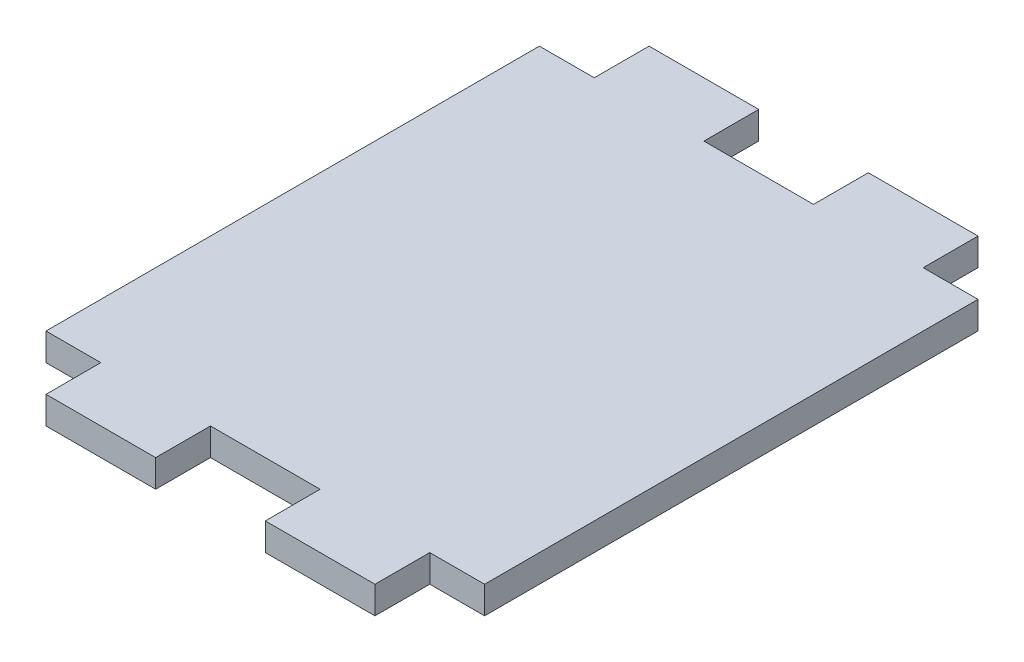
ISO-10303-21;
HEADER;
FILE_DESCRIPTION(('STEP AP214'),'2;1');
FILE_NAME('part.step','',(''),(''),'','','');
FILE_SCHEMA(('AUTOMOTIVE_DESIGN { 1 0 10303 214 1 1 1 1 }'));
ENDSEC;
DATA;
#1=APPLICATION_CONTEXT('core data for automotive mechanical design processes');
#2=APPLICATION_PROTOCOL_DEFINITION('international standard','automotive_design',2000,#1);
#3=PRODUCT_CONTEXT('',#1,'mechanical');
#4=PRODUCT('Part','Part','',(#3));
#5=PRODUCT_RELATED_PRODUCT_CATEGORY('part','',(#4));
#6=PRODUCT_DEFINITION_FORMATION('','',#4);
#7=PRODUCT_DEFINITION_CONTEXT('part definition',#1,'design');
#8=PRODUCT_DEFINITION('design','',#6,#7);
#9=PRODUCT_DEFINITION_SHAPE('','',#8);
#10=(LENGTH_UNIT() NAMED_UNIT(*) SI_UNIT(.MILLI.,.METRE.));
#11=(NAMED_UNIT(*) PLANE_ANGLE_UNIT() SI_UNIT($,.RADIAN.));
#12=(NAMED_UNIT(*) SI_UNIT($,.STERADIAN.) SOLID_ANGLE_UNIT());
#13=UNCERTAINTY_MEASURE_WITH_UNIT(LENGTH_MEASURE(1.E-05),#10,'distance_accuracy_value','');
#14=(GEOMETRIC_REPRESENTATION_CONTEXT(3) GLOBAL_UNCERTAINTY_ASSIGNED_CONTEXT((#13)) GLOBAL_UNIT_ASSIGNED_CONTEXT((#10,
#11,#12)) REPRESENTATION_CONTEXT('',''));
#15=CARTESIAN_POINT('',(0.,0.,0.));
#16=DIRECTION('',(0.,0.,1.));
#17=DIRECTION('',(1.,0.,0.));
#18=AXIS2_PLACEMENT_3D('',#15,#16,#17);
#19=CARTESIAN_POINT('',(0.,0.,0.));
#20=DIRECTION('',(0.,0.,1.));
#21=DIRECTION('',(1.,0.,0.));
#22=AXIS2_PLACEMENT_3D('',#19,#20,#21);
#23=PLANE('',#22);
#24=DIRECTION('',(0.,1.,0.));
#25=VECTOR('',#24,1.);
#26=CARTESIAN_POINT('',(285.040948436872,355.55542840225,0.));
#27=LINE('',#26,#25);
#28=CARTESIAN_POINT('',(285.040948436872,355.55542840225,0.));
#29=VERTEX_POINT('',#28);
#30=CARTESIAN_POINT('',(285.040948436872,358.73042840225,0.));
#31=VERTEX_POINT('',#30);
#32=EDGE_CURVE('E342',#29,#31,#27,.T.);
#33=ORIENTED_EDGE('',*,*,#32,.T.);
#34=DIRECTION('',(-1.,0.,0.));
#35=VECTOR('',#34,1.);
#36=CARTESIAN_POINT('',(316.790948436872,358.73042840225,0.));
#37=LINE('',#36,#35);
#38=CARTESIAN_POINT('',(272.340948436872,358.73042840225,0.));
#39=VERTEX_POINT('',#38);
#40=EDGE_CURVE('E230',#31,#39,#37,.T.);
#41=ORIENTED_EDGE('',*,*,#40,.T.);
#42=DIRECTION('',(0.,1.,0.));
#43=VECTOR('',#42,1.);
#44=CARTESIAN_POINT('',(272.340948436872,355.55542840225,0.));
#45=LINE('',#44,#43);
#46=CARTESIAN_POINT('',(272.340948436872,355.55542840225,0.));
#47=VERTEX_POINT('',#46);
#48=EDGE_CURVE('E274',#47,#39,#45,.T.);
#49=ORIENTED_EDGE('',*,*,#48,.F.);
#50=DIRECTION('',(1.,0.,0.));
#51=VECTOR('',#50,1.);
#52=CARTESIAN_POINT('',(265.990948436872,355.55542840225,0.));
#53=LINE('',#52,#51);
#54=EDGE_CURVE('E245',#47,#29,#53,.T.);
#55=ORIENTED_EDGE('',*,*,#54,.T.);
#56=EDGE_LOOP('',(#33,#41,#49,#55));
#57=FACE_BOUND('',#56,.T.);
#58=ADVANCED_FACE('F33',(#57),#23,.T.);
#59=CARTESIAN_POINT('',(0.,0.,-69.85));
#60=DIRECTION('',(0.,0.,1.));
#61=DIRECTION('',(1.,0.,0.));
#62=AXIS2_PLACEMENT_3D('',#59,#60,#61);
#63=PLANE('',#62);
#64=DIRECTION('',(-1.,0.,0.));
#65=VECTOR('',#64,1.);
#66=CARTESIAN_POINT('',(316.790948436872,358.73042840225,-69.85));
#67=LINE('',#66,#65);
#68=CARTESIAN_POINT('',(285.040948436872,358.73042840225,-69.85));
#69=VERTEX_POINT('',#68);
#70=CARTESIAN_POINT('',(272.340948436872,358.73042840225,-69.85));
#71=VERTEX_POINT('',#70);
#72=EDGE_CURVE('E238',#69,#71,#67,.T.);
#73=ORIENTED_EDGE('',*,*,#72,.F.);
#74=DIRECTION('',(0.,1.,0.));
#75=VECTOR('',#74,1.);
#76=CARTESIAN_POINT('',(285.040948436872,355.55542840225,-69.85));
#77=LINE('',#76,#75);
#78=CARTESIAN_POINT('',(285.040948436872,355.55542840225,-69.85));
#79=VERTEX_POINT('',#78);
#80=EDGE_CURVE('E209',#79,#69,#77,.T.);
#81=ORIENTED_EDGE('',*,*,#80,.F.);
#82=DIRECTION('',(1.,0.,0.));
#83=VECTOR('',#82,1.);
#84=CARTESIAN_POINT('',(265.990948436872,355.55542840225,-69.85));
#85=LINE('',#84,#83);
#86=CARTESIAN_POINT('',(272.340948436872,355.55542840225,-69.85));
#87=VERTEX_POINT('',#86);
#88=EDGE_CURVE('E239',#87,#79,#85,.T.);
#89=ORIENTED_EDGE('',*,*,#88,.F.);
#90=DIRECTION('',(0.,1.,0.));
#91=VECTOR('',#90,1.);
#92=CARTESIAN_POINT('',(272.340948436872,355.55542840225,-69.85));
#93=LINE('',#92,#91);
#94=EDGE_CURVE('E227',#87,#71,#93,.T.);
#95=ORIENTED_EDGE('',*,*,#94,.T.);
#96=EDGE_LOOP('',(#73,#81,#89,#95));
#97=FACE_BOUND('',#96,.T.);
#98=ADVANCED_FACE('F393',(#97),#63,.F.);
#99=CARTESIAN_POINT('',(316.790948436872,355.55542840225,-69.85));
#100=DIRECTION('',(1.,0.,0.));
#101=DIRECTION('',(0.,1.,0.));
#102=AXIS2_PLACEMENT_3D('',#99,#100,#101);
#103=PLANE('',#102);
#104=DIRECTION('',(0.,1.,0.));
#105=VECTOR('',#104,1.);
#106=CARTESIAN_POINT('',(316.790948436872,355.55542840225,-6.35000000000002));
#107=LINE('',#106,#105);
#108=CARTESIAN_POINT('',(316.790948436872,355.55542840225,-6.35000000000002));
#109=VERTEX_POINT('',#108);
#110=CARTESIAN_POINT('',(316.790948436872,358.73042840225,-6.35000000000002));
#111=VERTEX_POINT('',#110);
#112=EDGE_CURVE('E176',#109,#111,#107,.T.);
#113=ORIENTED_EDGE('',*,*,#112,.F.);
#114=DIRECTION('',(0.,0.,1.));
#115=VECTOR('',#114,1.);
#116=CARTESIAN_POINT('',(316.790948436872,355.55542840225,-69.85));
#117=LINE('',#116,#115);
#118=CARTESIAN_POINT('',(316.790948436872,355.55542840225,-63.5));
#119=VERTEX_POINT('',#118);
#120=EDGE_CURVE('E11',#119,#109,#117,.T.);
#121=ORIENTED_EDGE('',*,*,#120,.F.);
#122=DIRECTION('',(0.,1.,0.));
#123=VECTOR('',#122,1.);
#124=CARTESIAN_POINT('',(316.790948436872,355.55542840225,-63.5));
#125=LINE('',#124,#123);
#126=CARTESIAN_POINT('',(316.790948436872,358.73042840225,-63.5));
#127=VERTEX_POINT('',#126);
#128=EDGE_CURVE('E211',#119,#127,#125,.T.);
#129=ORIENTED_EDGE('',*,*,#128,.T.);
#130=DIRECTION('',(0.,0.,1.));
#131=VECTOR('',#130,1.);
#132=CARTESIAN_POINT('',(316.790948436872,358.73042840225,-69.85));
#133=LINE('',#132,#131);
#134=EDGE_CURVE('E37',#127,#111,#133,.T.);
#135=ORIENTED_EDGE('',*,*,#134,.T.);
#136=EDGE_LOOP('',(#113,#121,#129,#135));
#137=FACE_BOUND('',#136,.T.);
#138=ADVANCED_FACE('F35',(#137),#103,.T.);
#139=CARTESIAN_POINT('',(265.990948436872,355.55542840225,-69.85));
#140=DIRECTION('',(0.,-1.,0.));
#141=DIRECTION('',(0.,0.,-1.));
#142=AXIS2_PLACEMENT_3D('',#139,#140,#141);
#143=PLANE('',#142);
#144=DIRECTION('',(0.,0.,1.));
#145=VECTOR('',#144,1.);
#146=CARTESIAN_POINT('',(310.440948436872,355.55542840225,0.));
#147=LINE('',#146,#145);
#148=CARTESIAN_POINT('',(310.440948436872,355.55542840225,-6.35000000000002));
#149=VERTEX_POINT('',#148);
#150=CARTESIAN_POINT('',(310.440948436872,355.55542840225,0.));
#151=VERTEX_POINT('',#150);
#152=EDGE_CURVE('E182',#149,#151,#147,.T.);
#153=ORIENTED_EDGE('',*,*,#152,.T.);
#154=CARTESIAN_POINT('',(297.740948436872,355.55542840225,0.));
#155=VERTEX_POINT('',#154);
#156=EDGE_CURVE('E244',#155,#151,#53,.T.);
#157=ORIENTED_EDGE('',*,*,#156,.F.);
#158=DIRECTION('',(0.,0.,-1.));
#159=VECTOR('',#158,1.);
#160=CARTESIAN_POINT('',(297.740948436872,355.55542840225,0.));
#161=LINE('',#160,#159);
#162=CARTESIAN_POINT('',(297.740948436872,355.55542840225,-6.35000000000002));
#163=VERTEX_POINT('',#162);
#164=EDGE_CURVE('E58',#155,#163,#161,.T.);
#165=ORIENTED_EDGE('',*,*,#164,.T.);
#166=DIRECTION('',(-1.,0.,0.));
#167=VECTOR('',#166,1.);
#168=CARTESIAN_POINT('',(285.040948436872,355.55542840225,-6.35000000000002));
#169=LINE('',#168,#167);
#170=CARTESIAN_POINT('',(285.040948436872,355.55542840225,-6.35000000000002));
#171=VERTEX_POINT('',#170);
#172=EDGE_CURVE('E339',#163,#171,#169,.T.);
#173=ORIENTED_EDGE('',*,*,#172,.T.);
#174=DIRECTION('',(0.,0.,1.));
#175=VECTOR('',#174,1.);
#176=CARTESIAN_POINT('',(285.040948436872,355.55542840225,0.));
#177=LINE('',#176,#175);
#178=EDGE_CURVE('E334',#171,#29,#177,.T.);
#179=ORIENTED_EDGE('',*,*,#178,.T.);
#180=ORIENTED_EDGE('',*,*,#54,.F.);
#181=DIRECTION('',(0.,0.,-1.));
#182=VECTOR('',#181,1.);
#183=CARTESIAN_POINT('',(272.340948436872,355.55542840225,0.));
#184=LINE('',#183,#182);
#185=CARTESIAN_POINT('',(272.340948436872,355.55542840225,-6.35000000000002));
#186=VERTEX_POINT('',#185);
#187=EDGE_CURVE('E358',#47,#186,#184,.T.);
#188=ORIENTED_EDGE('',*,*,#187,.T.);
#189=DIRECTION('',(-1.,0.,0.));
#190=VECTOR('',#189,1.);
#191=CARTESIAN_POINT('',(265.990948436872,355.55542840225,-6.35000000000002));
#192=LINE('',#191,#190);
#193=CARTESIAN_POINT('',(265.990948436872,355.55542840225,-6.35000000000002));
#194=VERTEX_POINT('',#193);
#195=EDGE_CURVE('E281',#186,#194,#192,.T.);
#196=ORIENTED_EDGE('',*,*,#195,.T.);
#197=DIRECTION('',(0.,0.,1.));
#198=VECTOR('',#197,1.);
#199=CARTESIAN_POINT('',(265.990948436872,355.55542840225,-69.85));
#200=LINE('',#199,#198);
#201=CARTESIAN_POINT('',(265.990948436872,355.55542840225,-63.5));
#202=VERTEX_POINT('',#201);
#203=EDGE_CURVE('E42',#202,#194,#200,.T.);
#204=ORIENTED_EDGE('',*,*,#203,.F.);
#205=DIRECTION('',(1.,0.,0.));
#206=VECTOR('',#205,1.);
#207=CARTESIAN_POINT('',(265.990948436872,355.55542840225,-63.5));
#208=LINE('',#207,#206);
#209=CARTESIAN_POINT('',(272.340948436872,355.55542840225,-63.5));
#210=VERTEX_POINT('',#209);
#211=EDGE_CURVE('E215',#202,#210,#208,.T.);
#212=ORIENTED_EDGE('',*,*,#211,.T.);
#213=DIRECTION('',(0.,0.,-1.));
#214=VECTOR('',#213,1.);
#215=CARTESIAN_POINT('',(272.340948436872,355.55542840225,-69.85));
#216=LINE('',#215,#214);
#217=EDGE_CURVE('E218',#210,#87,#216,.T.);
#218=ORIENTED_EDGE('',*,*,#217,.T.);
#219=ORIENTED_EDGE('',*,*,#88,.T.);
#220=DIRECTION('',(0.,0.,1.));
#221=VECTOR('',#220,1.);
#222=CARTESIAN_POINT('',(285.040948436872,355.55542840225,-69.85));
#223=LINE('',#222,#221);
#224=CARTESIAN_POINT('',(285.040948436872,355.55542840225,-63.5));
#225=VERTEX_POINT('',#224);
#226=EDGE_CURVE('E282',#79,#225,#223,.T.);
#227=ORIENTED_EDGE('',*,*,#226,.T.);
#228=DIRECTION('',(1.,0.,0.));
#229=VECTOR('',#228,1.);
#230=CARTESIAN_POINT('',(285.040948436872,355.55542840225,-63.5));
#231=LINE('',#230,#229);
#232=CARTESIAN_POINT('',(297.740948436872,355.55542840225,-63.5));
#233=VERTEX_POINT('',#232);
#234=EDGE_CURVE('E285',#225,#233,#231,.T.);
#235=ORIENTED_EDGE('',*,*,#234,.T.);
#236=DIRECTION('',(0.,0.,-1.));
#237=VECTOR('',#236,1.);
#238=CARTESIAN_POINT('',(297.740948436872,355.55542840225,-69.85));
#239=LINE('',#238,#237);
#240=CARTESIAN_POINT('',(297.740948436872,355.55542840225,-69.85));
#241=VERTEX_POINT('',#240);
#242=EDGE_CURVE('E289',#233,#241,#239,.T.);
#243=ORIENTED_EDGE('',*,*,#242,.T.);
#244=CARTESIAN_POINT('',(310.440948436872,355.55542840225,-69.85));
#245=VERTEX_POINT('',#244);
#246=EDGE_CURVE('E237',#241,#245,#85,.T.);
#247=ORIENTED_EDGE('',*,*,#246,.T.);
#248=DIRECTION('',(0.,0.,1.));
#249=VECTOR('',#248,1.);
#250=CARTESIAN_POINT('',(310.440948436872,355.55542840225,-69.85));
#251=LINE('',#250,#249);
#252=CARTESIAN_POINT('',(310.440948436872,355.55542840225,-63.5));
#253=VERTEX_POINT('',#252);
#254=EDGE_CURVE('E196',#245,#253,#251,.T.);
#255=ORIENTED_EDGE('',*,*,#254,.T.);
#256=DIRECTION('',(1.,0.,0.));
#257=VECTOR('',#256,1.);
#258=CARTESIAN_POINT('',(316.790948436872,355.55542840225,-63.5));
#259=LINE('',#258,#257);
#260=EDGE_CURVE('E194',#253,#119,#259,.T.);
#261=ORIENTED_EDGE('',*,*,#260,.T.);
#262=ORIENTED_EDGE('',*,*,#120,.T.);
#263=DIRECTION('',(-1.,0.,0.));
#264=VECTOR('',#263,1.);
#265=CARTESIAN_POINT('',(316.790948436872,355.55542840225,-6.35000000000002));
#266=LINE('',#265,#264);
#267=EDGE_CURVE('E172',#109,#149,#266,.T.);
#268=ORIENTED_EDGE('',*,*,#267,.T.);
#269=EDGE_LOOP('',(#153,#157,#165,#173,#179,#180,#188,#196,#204,#212,#218,#219,#227,#235,#243,
#247,#255,#261,#262,#268));
#270=FACE_BOUND('',#269,.T.);
#271=ADVANCED_FACE('F191',(#270),#143,.T.);
#272=CARTESIAN_POINT('',(265.990948436872,358.73042840225,-69.85));
#273=DIRECTION('',(-1.,0.,0.));
#274=DIRECTION('',(0.,0.,1.));
#275=AXIS2_PLACEMENT_3D('',#272,#273,#274);
#276=PLANE('',#275);
#277=DIRECTION('',(0.,1.,0.));
#278=VECTOR('',#277,1.);
#279=CARTESIAN_POINT('',(265.990948436872,355.55542840225,-6.35000000000002));
#280=LINE('',#279,#278);
#281=CARTESIAN_POINT('',(265.990948436872,358.73042840225,-6.35000000000002));
#282=VERTEX_POINT('',#281);
#283=EDGE_CURVE('E264',#194,#282,#280,.T.);
#284=ORIENTED_EDGE('',*,*,#283,.T.);
#285=DIRECTION('',(0.,0.,1.));
#286=VECTOR('',#285,1.);
#287=CARTESIAN_POINT('',(265.990948436872,358.73042840225,-69.85));
#288=LINE('',#287,#286);
#289=CARTESIAN_POINT('',(265.990948436872,358.73042840225,-63.5));
#290=VERTEX_POINT('',#289);
#291=EDGE_CURVE('E249',#290,#282,#288,.T.);
#292=ORIENTED_EDGE('',*,*,#291,.F.);
#293=DIRECTION('',(0.,1.,0.));
#294=VECTOR('',#293,1.);
#295=CARTESIAN_POINT('',(265.990948436872,355.55542840225,-63.5));
#296=LINE('',#295,#294);
#297=EDGE_CURVE('E222',#202,#290,#296,.T.);
#298=ORIENTED_EDGE('',*,*,#297,.F.);
#299=ORIENTED_EDGE('',*,*,#203,.T.);
#300=EDGE_LOOP('',(#284,#292,#298,#299));
#301=FACE_BOUND('',#300,.T.);
#302=ADVANCED_FACE('F262',(#301),#276,.T.);
#303=CARTESIAN_POINT('',(316.790948436872,358.73042840225,-69.85));
#304=DIRECTION('',(0.,1.,0.));
#305=DIRECTION('',(0.,0.,1.));
#306=AXIS2_PLACEMENT_3D('',#303,#304,#305);
#307=PLANE('',#306);
#308=DIRECTION('',(0.,0.,1.));
#309=VECTOR('',#308,1.);
#310=CARTESIAN_POINT('',(310.440948436872,358.73042840225,0.));
#311=LINE('',#310,#309);
#312=CARTESIAN_POINT('',(310.440948436872,358.73042840225,-6.35000000000002));
#313=VERTEX_POINT('',#312);
#314=CARTESIAN_POINT('',(310.440948436872,358.73042840225,0.));
#315=VERTEX_POINT('',#314);
#316=EDGE_CURVE('E50',#313,#315,#311,.T.);
#317=ORIENTED_EDGE('',*,*,#316,.F.);
#318=DIRECTION('',(-1.,0.,0.));
#319=VECTOR('',#318,1.);
#320=CARTESIAN_POINT('',(316.790948436872,358.73042840225,-6.35000000000002));
#321=LINE('',#320,#319);
#322=EDGE_CURVE('E324',#111,#313,#321,.T.);
#323=ORIENTED_EDGE('',*,*,#322,.F.);
#324=ORIENTED_EDGE('',*,*,#134,.F.);
#325=DIRECTION('',(1.,0.,0.));
#326=VECTOR('',#325,1.);
#327=CARTESIAN_POINT('',(316.790948436872,358.73042840225,-63.5));
#328=LINE('',#327,#326);
#329=CARTESIAN_POINT('',(310.440948436872,358.73042840225,-63.5));
#330=VERTEX_POINT('',#329);
#331=EDGE_CURVE('E202',#330,#127,#328,.T.);
#332=ORIENTED_EDGE('',*,*,#331,.F.);
#333=DIRECTION('',(0.,0.,1.));
#334=VECTOR('',#333,1.);
#335=CARTESIAN_POINT('',(310.440948436872,358.73042840225,-69.85));
#336=LINE('',#335,#334);
#337=CARTESIAN_POINT('',(310.440948436872,358.73042840225,-69.85));
#338=VERTEX_POINT('',#337);
#339=EDGE_CURVE('E206',#338,#330,#336,.T.);
#340=ORIENTED_EDGE('',*,*,#339,.F.);
#341=CARTESIAN_POINT('',(297.740948436872,358.73042840225,-69.85));
#342=VERTEX_POINT('',#341);
#343=EDGE_CURVE('E234',#338,#342,#67,.T.);
#344=ORIENTED_EDGE('',*,*,#343,.T.);
#345=DIRECTION('',(0.,0.,-1.));
#346=VECTOR('',#345,1.);
#347=CARTESIAN_POINT('',(297.740948436872,358.73042840225,-69.85));
#348=LINE('',#347,#346);
#349=CARTESIAN_POINT('',(297.740948436872,358.73042840225,-63.5));
#350=VERTEX_POINT('',#349);
#351=EDGE_CURVE('E286',#350,#342,#348,.T.);
#352=ORIENTED_EDGE('',*,*,#351,.F.);
#353=DIRECTION('',(1.,0.,0.));
#354=VECTOR('',#353,1.);
#355=CARTESIAN_POINT('',(285.040948436872,358.73042840225,-63.5));
#356=LINE('',#355,#354);
#357=CARTESIAN_POINT('',(285.040948436872,358.73042840225,-63.5));
#358=VERTEX_POINT('',#357);
#359=EDGE_CURVE('E272',#358,#350,#356,.T.);
#360=ORIENTED_EDGE('',*,*,#359,.F.);
#361=DIRECTION('',(0.,0.,1.));
#362=VECTOR('',#361,1.);
#363=CARTESIAN_POINT('',(285.040948436872,358.73042840225,-69.85));
#364=LINE('',#363,#362);
#365=EDGE_CURVE('E268',#69,#358,#364,.T.);
#366=ORIENTED_EDGE('',*,*,#365,.F.);
#367=ORIENTED_EDGE('',*,*,#72,.T.);
#368=DIRECTION('',(0.,0.,-1.));
#369=VECTOR('',#368,1.);
#370=CARTESIAN_POINT('',(272.340948436872,358.73042840225,-69.85));
#371=LINE('',#370,#369);
#372=CARTESIAN_POINT('',(272.340948436872,358.73042840225,-63.5));
#373=VERTEX_POINT('',#372);
#374=EDGE_CURVE('E219',#373,#71,#371,.T.);
#375=ORIENTED_EDGE('',*,*,#374,.F.);
#376=DIRECTION('',(1.,0.,0.));
#377=VECTOR('',#376,1.);
#378=CARTESIAN_POINT('',(265.990948436872,358.73042840225,-63.5));
#379=LINE('',#378,#377);
#380=EDGE_CURVE('E213',#290,#373,#379,.T.);
#381=ORIENTED_EDGE('',*,*,#380,.F.);
#382=ORIENTED_EDGE('',*,*,#291,.T.);
#383=DIRECTION('',(-1.,0.,0.));
#384=VECTOR('',#383,1.);
#385=CARTESIAN_POINT('',(265.990948436872,358.73042840225,-6.35000000000002));
#386=LINE('',#385,#384);
#387=CARTESIAN_POINT('',(272.340948436872,358.73042840225,-6.35000000000002));
#388=VERTEX_POINT('',#387);
#389=EDGE_CURVE('E257',#388,#282,#386,.T.);
#390=ORIENTED_EDGE('',*,*,#389,.F.);
#391=DIRECTION('',(0.,0.,-1.));
#392=VECTOR('',#391,1.);
#393=CARTESIAN_POINT('',(272.340948436872,358.73042840225,0.));
#394=LINE('',#393,#392);
#395=EDGE_CURVE('E351',#39,#388,#394,.T.);
#396=ORIENTED_EDGE('',*,*,#395,.F.);
#397=ORIENTED_EDGE('',*,*,#40,.F.);
#398=DIRECTION('',(0.,0.,1.));
#399=VECTOR('',#398,1.);
#400=CARTESIAN_POINT('',(285.040948436872,358.73042840225,0.));
#401=LINE('',#400,#399);
#402=CARTESIAN_POINT('',(285.040948436872,358.73042840225,-6.35000000000002));
#403=VERTEX_POINT('',#402);
#404=EDGE_CURVE('E332',#403,#31,#401,.T.);
#405=ORIENTED_EDGE('',*,*,#404,.F.);
#406=DIRECTION('',(-1.,0.,0.));
#407=VECTOR('',#406,1.);
#408=CARTESIAN_POINT('',(285.040948436872,358.73042840225,-6.35000000000002));
#409=LINE('',#408,#407);
#410=CARTESIAN_POINT('',(297.740948436872,358.73042840225,-6.35000000000002));
#411=VERTEX_POINT('',#410);
#412=EDGE_CURVE('E337',#411,#403,#409,.T.);
#413=ORIENTED_EDGE('',*,*,#412,.F.);
#414=DIRECTION('',(0.,0.,-1.));
#415=VECTOR('',#414,1.);
#416=CARTESIAN_POINT('',(297.740948436872,358.73042840225,0.));
#417=LINE('',#416,#415);
#418=CARTESIAN_POINT('',(297.740948436872,358.73042840225,0.));
#419=VERTEX_POINT('',#418);
#420=EDGE_CURVE('E344',#419,#411,#417,.T.);
#421=ORIENTED_EDGE('',*,*,#420,.F.);
#422=EDGE_CURVE('E242',#315,#419,#37,.T.);
#423=ORIENTED_EDGE('',*,*,#422,.F.);
#424=EDGE_LOOP('',(#317,#323,#324,#332,#340,#344,#352,#360,#366,#367,#375,#381,#382,#390,#396,
#397,#405,#413,#421,#423));
#425=FACE_BOUND('',#424,.T.);
#426=ADVANCED_FACE('F255',(#425),#307,.T.);
#427=ORIENTED_EDGE('',*,*,#246,.F.);
#428=DIRECTION('',(0.,1.,0.));
#429=VECTOR('',#428,1.);
#430=CARTESIAN_POINT('',(297.740948436872,355.55542840225,-69.85));
#431=LINE('',#430,#429);
#432=EDGE_CURVE('E297',#241,#342,#431,.T.);
#433=ORIENTED_EDGE('',*,*,#432,.T.);
#434=ORIENTED_EDGE('',*,*,#343,.F.);
#435=DIRECTION('',(0.,1.,0.));
#436=VECTOR('',#435,1.);
#437=CARTESIAN_POINT('',(310.440948436872,355.55542840225,-69.85));
#438=LINE('',#437,#436);
#439=EDGE_CURVE('E198',#245,#338,#438,.T.);
#440=ORIENTED_EDGE('',*,*,#439,.F.);
#441=EDGE_LOOP('',(#427,#433,#434,#440));
#442=FACE_BOUND('',#441,.T.);
#443=ADVANCED_FACE('F318',(#442),#63,.F.);
#444=DIRECTION('',(0.,1.,0.));
#445=VECTOR('',#444,1.);
#446=CARTESIAN_POINT('',(310.440948436872,355.55542840225,0.));
#447=LINE('',#446,#445);
#448=EDGE_CURVE('E330',#151,#315,#447,.T.);
#449=ORIENTED_EDGE('',*,*,#448,.T.);
#450=ORIENTED_EDGE('',*,*,#422,.T.);
#451=DIRECTION('',(0.,1.,0.));
#452=VECTOR('',#451,1.);
#453=CARTESIAN_POINT('',(297.740948436872,355.55542840225,0.));
#454=LINE('',#453,#452);
#455=EDGE_CURVE('E354',#155,#419,#454,.T.);
#456=ORIENTED_EDGE('',*,*,#455,.F.);
#457=ORIENTED_EDGE('',*,*,#156,.T.);
#458=EDGE_LOOP('',(#449,#450,#456,#457));
#459=FACE_BOUND('',#458,.T.);
#460=ADVANCED_FACE('F382',(#459),#23,.T.);
#461=CARTESIAN_POINT('',(272.340948436872,355.55542840225,-69.85));
#462=DIRECTION('',(1.,0.,0.));
#463=DIRECTION('',(0.,0.,-1.));
#464=AXIS2_PLACEMENT_3D('',#461,#462,#463);
#465=PLANE('',#464);
#466=ORIENTED_EDGE('',*,*,#374,.T.);
#467=ORIENTED_EDGE('',*,*,#94,.F.);
#468=ORIENTED_EDGE('',*,*,#217,.F.);
#469=DIRECTION('',(0.,1.,0.));
#470=VECTOR('',#469,1.);
#471=CARTESIAN_POINT('',(272.340948436872,355.55542840225,-63.5));
#472=LINE('',#471,#470);
#473=EDGE_CURVE('E231',#210,#373,#472,.T.);
#474=ORIENTED_EDGE('',*,*,#473,.T.);
#475=EDGE_LOOP('',(#466,#467,#468,#474));
#476=FACE_BOUND('',#475,.T.);
#477=ADVANCED_FACE('F402',(#476),#465,.F.);
#478=CARTESIAN_POINT('',(265.990948436872,355.55542840225,-63.5));
#479=DIRECTION('',(0.,0.,1.));
#480=DIRECTION('',(1.,0.,0.));
#481=AXIS2_PLACEMENT_3D('',#478,#479,#480);
#482=PLANE('',#481);
#483=ORIENTED_EDGE('',*,*,#380,.T.);
#484=ORIENTED_EDGE('',*,*,#473,.F.);
#485=ORIENTED_EDGE('',*,*,#211,.F.);
#486=ORIENTED_EDGE('',*,*,#297,.T.);
#487=EDGE_LOOP('',(#483,#484,#485,#486));
#488=FACE_BOUND('',#487,.T.);
#489=ADVANCED_FACE('F407',(#488),#482,.F.);
#490=CARTESIAN_POINT('',(316.790948436872,355.55542840225,-63.5));
#491=DIRECTION('',(0.,0.,1.));
#492=DIRECTION('',(1.,0.,0.));
#493=AXIS2_PLACEMENT_3D('',#490,#491,#492);
#494=PLANE('',#493);
#495=ORIENTED_EDGE('',*,*,#331,.T.);
#496=ORIENTED_EDGE('',*,*,#128,.F.);
#497=ORIENTED_EDGE('',*,*,#260,.F.);
#498=DIRECTION('',(0.,1.,0.));
#499=VECTOR('',#498,1.);
#500=CARTESIAN_POINT('',(310.440948436872,355.55542840225,-63.5));
#501=LINE('',#500,#499);
#502=EDGE_CURVE('E200',#253,#330,#501,.T.);
#503=ORIENTED_EDGE('',*,*,#502,.T.);
#504=EDGE_LOOP('',(#495,#496,#497,#503));
#505=FACE_BOUND('',#504,.T.);
#506=ADVANCED_FACE('F323',(#505),#494,.F.);
#507=CARTESIAN_POINT('',(310.440948436872,355.55542840225,-69.85));
#508=DIRECTION('',(-1.,0.,0.));
#509=DIRECTION('',(0.,0.,1.));
#510=AXIS2_PLACEMENT_3D('',#507,#508,#509);
#511=PLANE('',#510);
#512=ORIENTED_EDGE('',*,*,#339,.T.);
#513=ORIENTED_EDGE('',*,*,#502,.F.);
#514=ORIENTED_EDGE('',*,*,#254,.F.);
#515=ORIENTED_EDGE('',*,*,#439,.T.);
#516=EDGE_LOOP('',(#512,#513,#514,#515));
#517=FACE_BOUND('',#516,.T.);
#518=ADVANCED_FACE('F321',(#517),#511,.F.);
#519=CARTESIAN_POINT('',(285.040948436872,355.55542840225,-69.85));
#520=DIRECTION('',(-1.,0.,0.));
#521=DIRECTION('',(0.,0.,1.));
#522=AXIS2_PLACEMENT_3D('',#519,#520,#521);
#523=PLANE('',#522);
#524=ORIENTED_EDGE('',*,*,#365,.T.);
#525=DIRECTION('',(0.,1.,0.));
#526=VECTOR('',#525,1.);
#527=CARTESIAN_POINT('',(285.040948436872,355.55542840225,-63.5));
#528=LINE('',#527,#526);
#529=EDGE_CURVE('E291',#225,#358,#528,.T.);
#530=ORIENTED_EDGE('',*,*,#529,.F.);
#531=ORIENTED_EDGE('',*,*,#226,.F.);
#532=ORIENTED_EDGE('',*,*,#80,.T.);
#533=EDGE_LOOP('',(#524,#530,#531,#532));
#534=FACE_BOUND('',#533,.T.);
#535=ADVANCED_FACE('F308',(#534),#523,.F.);
#536=CARTESIAN_POINT('',(297.740948436872,355.55542840225,-69.85));
#537=DIRECTION('',(1.,0.,0.));
#538=DIRECTION('',(0.,0.,-1.));
#539=AXIS2_PLACEMENT_3D('',#536,#537,#538);
#540=PLANE('',#539);
#541=ORIENTED_EDGE('',*,*,#351,.T.);
#542=ORIENTED_EDGE('',*,*,#432,.F.);
#543=ORIENTED_EDGE('',*,*,#242,.F.);
#544=DIRECTION('',(0.,1.,0.));
#545=VECTOR('',#544,1.);
#546=CARTESIAN_POINT('',(297.740948436872,355.55542840225,-63.5));
#547=LINE('',#546,#545);
#548=EDGE_CURVE('E300',#233,#350,#547,.T.);
#549=ORIENTED_EDGE('',*,*,#548,.T.);
#550=EDGE_LOOP('',(#541,#542,#543,#549));
#551=FACE_BOUND('',#550,.T.);
#552=ADVANCED_FACE('F314',(#551),#540,.F.);
#553=CARTESIAN_POINT('',(285.040948436872,355.55542840225,-63.5));
#554=DIRECTION('',(0.,0.,1.));
#555=DIRECTION('',(1.,0.,0.));
#556=AXIS2_PLACEMENT_3D('',#553,#554,#555);
#557=PLANE('',#556);
#558=ORIENTED_EDGE('',*,*,#359,.T.);
#559=ORIENTED_EDGE('',*,*,#548,.F.);
#560=ORIENTED_EDGE('',*,*,#234,.F.);
#561=ORIENTED_EDGE('',*,*,#529,.T.);
#562=EDGE_LOOP('',(#558,#559,#560,#561));
#563=FACE_BOUND('',#562,.T.);
#564=ADVANCED_FACE('F303',(#563),#557,.F.);
#565=CARTESIAN_POINT('',(265.990948436872,355.55542840225,-6.35000000000002));
#566=DIRECTION('',(0.,0.,-1.));
#567=DIRECTION('',(-1.,0.,0.));
#568=AXIS2_PLACEMENT_3D('',#565,#566,#567);
#569=PLANE('',#568);
#570=ORIENTED_EDGE('',*,*,#389,.T.);
#571=ORIENTED_EDGE('',*,*,#283,.F.);
#572=ORIENTED_EDGE('',*,*,#195,.F.);
#573=DIRECTION('',(0.,1.,0.));
#574=VECTOR('',#573,1.);
#575=CARTESIAN_POINT('',(272.340948436872,355.55542840225,-6.35000000000002));
#576=LINE('',#575,#574);
#577=EDGE_CURVE('E269',#186,#388,#576,.T.);
#578=ORIENTED_EDGE('',*,*,#577,.T.);
#579=EDGE_LOOP('',(#570,#571,#572,#578));
#580=FACE_BOUND('',#579,.T.);
#581=ADVANCED_FACE('F363',(#580),#569,.F.);
#582=CARTESIAN_POINT('',(272.340948436872,355.55542840225,0.));
#583=DIRECTION('',(1.,0.,0.));
#584=DIRECTION('',(0.,0.,-1.));
#585=AXIS2_PLACEMENT_3D('',#582,#583,#584);
#586=PLANE('',#585);
#587=ORIENTED_EDGE('',*,*,#395,.T.);
#588=ORIENTED_EDGE('',*,*,#577,.F.);
#589=ORIENTED_EDGE('',*,*,#187,.F.);
#590=ORIENTED_EDGE('',*,*,#48,.T.);
#591=EDGE_LOOP('',(#587,#588,#589,#590));
#592=FACE_BOUND('',#591,.T.);
#593=ADVANCED_FACE('F364',(#592),#586,.F.);
#594=CARTESIAN_POINT('',(285.040948436872,355.55542840225,0.));
#595=DIRECTION('',(-1.,0.,0.));
#596=DIRECTION('',(0.,0.,1.));
#597=AXIS2_PLACEMENT_3D('',#594,#595,#596);
#598=PLANE('',#597);
#599=ORIENTED_EDGE('',*,*,#404,.T.);
#600=ORIENTED_EDGE('',*,*,#32,.F.);
#601=ORIENTED_EDGE('',*,*,#178,.F.);
#602=DIRECTION('',(0.,1.,0.));
#603=VECTOR('',#602,1.);
#604=CARTESIAN_POINT('',(285.040948436872,355.55542840225,-6.35000000000002));
#605=LINE('',#604,#603);
#606=EDGE_CURVE('E349',#171,#403,#605,.T.);
#607=ORIENTED_EDGE('',*,*,#606,.T.);
#608=EDGE_LOOP('',(#599,#600,#601,#607));
#609=FACE_BOUND('',#608,.T.);
#610=ADVANCED_FACE('F372',(#609),#598,.F.);
#611=CARTESIAN_POINT('',(285.040948436872,355.55542840225,-6.35000000000002));
#612=DIRECTION('',(0.,0.,-1.));
#613=DIRECTION('',(-1.,0.,0.));
#614=AXIS2_PLACEMENT_3D('',#611,#612,#613);
#615=PLANE('',#614);
#616=ORIENTED_EDGE('',*,*,#412,.T.);
#617=ORIENTED_EDGE('',*,*,#606,.F.);
#618=ORIENTED_EDGE('',*,*,#172,.F.);
#619=DIRECTION('',(0.,1.,0.));
#620=VECTOR('',#619,1.);
#621=CARTESIAN_POINT('',(297.740948436872,355.55542840225,-6.35000000000002));
#622=LINE('',#621,#620);
#623=EDGE_CURVE('E352',#163,#411,#622,.T.);
#624=ORIENTED_EDGE('',*,*,#623,.T.);
#625=EDGE_LOOP('',(#616,#617,#618,#624));
#626=FACE_BOUND('',#625,.T.);
#627=ADVANCED_FACE('F377',(#626),#615,.F.);
#628=CARTESIAN_POINT('',(297.740948436872,355.55542840225,0.));
#629=DIRECTION('',(1.,0.,0.));
#630=DIRECTION('',(0.,0.,-1.));
#631=AXIS2_PLACEMENT_3D('',#628,#629,#630);
#632=PLANE('',#631);
#633=ORIENTED_EDGE('',*,*,#420,.T.);
#634=ORIENTED_EDGE('',*,*,#623,.F.);
#635=ORIENTED_EDGE('',*,*,#164,.F.);
#636=ORIENTED_EDGE('',*,*,#455,.T.);
#637=EDGE_LOOP('',(#633,#634,#635,#636));
#638=FACE_BOUND('',#637,.T.);
#639=ADVANCED_FACE('F378',(#638),#632,.F.);
#640=CARTESIAN_POINT('',(310.440948436872,355.55542840225,0.));
#641=DIRECTION('',(-1.,0.,0.));
#642=DIRECTION('',(0.,0.,1.));
#643=AXIS2_PLACEMENT_3D('',#640,#641,#642);
#644=PLANE('',#643);
#645=ORIENTED_EDGE('',*,*,#316,.T.);
#646=ORIENTED_EDGE('',*,*,#448,.F.);
#647=ORIENTED_EDGE('',*,*,#152,.F.);
#648=DIRECTION('',(0.,1.,0.));
#649=VECTOR('',#648,1.);
#650=CARTESIAN_POINT('',(310.440948436872,355.55542840225,-6.35000000000002));
#651=LINE('',#650,#649);
#652=EDGE_CURVE('E178',#149,#313,#651,.T.);
#653=ORIENTED_EDGE('',*,*,#652,.T.);
#654=EDGE_LOOP('',(#645,#646,#647,#653));
#655=FACE_BOUND('',#654,.T.);
#656=ADVANCED_FACE('F383',(#655),#644,.F.);
#657=CARTESIAN_POINT('',(316.790948436872,355.55542840225,-6.35000000000002));
#658=DIRECTION('',(0.,0.,-1.));
#659=DIRECTION('',(-1.,0.,0.));
#660=AXIS2_PLACEMENT_3D('',#657,#658,#659);
#661=PLANE('',#660);
#662=ORIENTED_EDGE('',*,*,#322,.T.);
#663=ORIENTED_EDGE('',*,*,#652,.F.);
#664=ORIENTED_EDGE('',*,*,#267,.F.);
#665=ORIENTED_EDGE('',*,*,#112,.T.);
#666=EDGE_LOOP('',(#662,#663,#664,#665));
#667=FACE_BOUND('',#666,.T.);
#668=ADVANCED_FACE('F175',(#667),#661,.F.);
#669=CLOSED_SHELL('',(#58,#98,#138,#271,#302,#426,#443,#460,#477,#489,#506,#518,#535,#552,#564,
#581,#593,#610,#627,#639,#656,#668));
#670=MANIFOLD_SOLID_BREP('B2',#669);
#671=ADVANCED_BREP_SHAPE_REPRESENTATION('',(#18,#670),#14);
#672=SHAPE_DEFINITION_REPRESENTATION(#9,#671);
ENDSEC;
END-ISO-10303-21;
